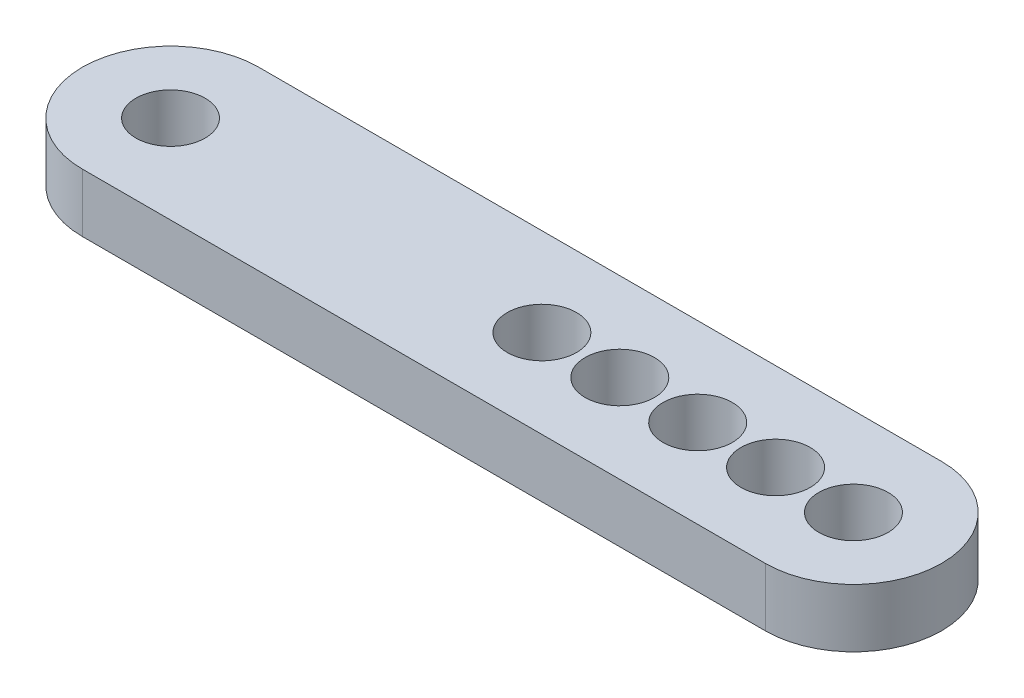
ISO-10303-21;
HEADER;
FILE_DESCRIPTION(('STEP AP214'),'2;1');
FILE_NAME('part.step','',(''),(''),'','','');
FILE_SCHEMA(('AUTOMOTIVE_DESIGN { 1 0 10303 214 1 1 1 1 }'));
ENDSEC;
DATA;
#1=APPLICATION_CONTEXT('core data for automotive mechanical design processes');
#2=APPLICATION_PROTOCOL_DEFINITION('international standard','automotive_design',2000,#1);
#3=PRODUCT_CONTEXT('',#1,'mechanical');
#4=PRODUCT('Part','Part','',(#3));
#5=PRODUCT_RELATED_PRODUCT_CATEGORY('part','',(#4));
#6=PRODUCT_DEFINITION_FORMATION('','',#4);
#7=PRODUCT_DEFINITION_CONTEXT('part definition',#1,'design');
#8=PRODUCT_DEFINITION('design','',#6,#7);
#9=PRODUCT_DEFINITION_SHAPE('','',#8);
#10=(LENGTH_UNIT() NAMED_UNIT(*) SI_UNIT(.MILLI.,.METRE.));
#11=(NAMED_UNIT(*) PLANE_ANGLE_UNIT() SI_UNIT($,.RADIAN.));
#12=(NAMED_UNIT(*) SI_UNIT($,.STERADIAN.) SOLID_ANGLE_UNIT());
#13=UNCERTAINTY_MEASURE_WITH_UNIT(LENGTH_MEASURE(1.E-05),#10,'distance_accuracy_value','');
#14=(GEOMETRIC_REPRESENTATION_CONTEXT(3) GLOBAL_UNCERTAINTY_ASSIGNED_CONTEXT((#13)) GLOBAL_UNIT_ASSIGNED_CONTEXT((#10,
#11,#12)) REPRESENTATION_CONTEXT('',''));
#15=CARTESIAN_POINT('',(0.,0.,0.));
#16=DIRECTION('',(0.,0.,1.));
#17=DIRECTION('',(1.,0.,0.));
#18=AXIS2_PLACEMENT_3D('',#15,#16,#17);
#19=CARTESIAN_POINT('',(0.,3.,0.));
#20=DIRECTION('',(0.,1.,0.));
#21=DIRECTION('',(0.,0.,1.));
#22=AXIS2_PLACEMENT_3D('',#19,#20,#21);
#23=PLANE('',#22);
#24=CARTESIAN_POINT('',(23.07,3.,0.));
#25=DIRECTION('',(0.,1.,0.));
#26=DIRECTION('',(0.,0.,1.));
#27=AXIS2_PLACEMENT_3D('',#24,#25,#26);
#28=CIRCLE('',#27,1.78);
#29=CARTESIAN_POINT('',(23.07,3.,1.78));
#30=VERTEX_POINT('',#29);
#31=EDGE_CURVE('E133',#30,#30,#28,.T.);
#32=ORIENTED_EDGE('',*,*,#31,.F.);
#33=EDGE_LOOP('',(#32));
#34=FACE_BOUND('',#33,.T.);
#35=CARTESIAN_POINT('',(31.07,3.,0.));
#36=DIRECTION('',(0.,1.,0.));
#37=DIRECTION('',(0.,0.,1.));
#38=AXIS2_PLACEMENT_3D('',#35,#36,#37);
#39=CIRCLE('',#38,1.78);
#40=CARTESIAN_POINT('',(31.07,3.,1.77999999999994));
#41=VERTEX_POINT('',#40);
#42=EDGE_CURVE('E121',#41,#41,#39,.T.);
#43=ORIENTED_EDGE('',*,*,#42,.F.);
#44=EDGE_LOOP('',(#43));
#45=FACE_BOUND('',#44,.T.);
#46=CARTESIAN_POINT('',(0.,3.,0.));
#47=DIRECTION('',(0.,1.,0.));
#48=DIRECTION('',(0.,0.,1.));
#49=AXIS2_PLACEMENT_3D('',#46,#47,#48);
#50=CIRCLE('',#49,1.778);
#51=CARTESIAN_POINT('',(0.,3.,1.778));
#52=VERTEX_POINT('',#51);
#53=EDGE_CURVE('E100',#52,#52,#50,.T.);
#54=ORIENTED_EDGE('',*,*,#53,.F.);
#55=EDGE_LOOP('',(#54));
#56=FACE_BOUND('',#55,.T.);
#57=CARTESIAN_POINT('',(0.,3.,0.));
#58=DIRECTION('',(0.,1.,0.));
#59=DIRECTION('',(0.,0.,1.));
#60=AXIS2_PLACEMENT_3D('',#57,#58,#59);
#61=CIRCLE('',#60,4.53);
#62=CARTESIAN_POINT('',(0.,3.,-4.53));
#63=VERTEX_POINT('',#62);
#64=CARTESIAN_POINT('',(0.,3.,4.53));
#65=VERTEX_POINT('',#64);
#66=EDGE_CURVE('E85',#63,#65,#61,.T.);
#67=ORIENTED_EDGE('',*,*,#66,.T.);
#68=DIRECTION('',(1.,0.,0.));
#69=VECTOR('',#68,1.);
#70=CARTESIAN_POINT('',(0.,3.,4.53));
#71=LINE('',#70,#69);
#72=CARTESIAN_POINT('',(35.07,3.,4.53));
#73=VERTEX_POINT('',#72);
#74=EDGE_CURVE('E80',#65,#73,#71,.T.);
#75=ORIENTED_EDGE('',*,*,#74,.T.);
#76=CARTESIAN_POINT('',(35.07,3.,0.));
#77=DIRECTION('',(0.,1.,0.));
#78=DIRECTION('',(0.,0.,1.));
#79=AXIS2_PLACEMENT_3D('',#76,#77,#78);
#80=CIRCLE('',#79,4.53);
#81=CARTESIAN_POINT('',(35.07,3.,-4.53));
#82=VERTEX_POINT('',#81);
#83=EDGE_CURVE('E83',#73,#82,#80,.T.);
#84=ORIENTED_EDGE('',*,*,#83,.T.);
#85=DIRECTION('',(-1.,0.,0.));
#86=VECTOR('',#85,1.);
#87=CARTESIAN_POINT('',(0.,3.,-4.53));
#88=LINE('',#87,#86);
#89=EDGE_CURVE('E50',#82,#63,#88,.T.);
#90=ORIENTED_EDGE('',*,*,#89,.T.);
#91=EDGE_LOOP('',(#67,#75,#84,#90));
#92=FACE_BOUND('',#91,.T.);
#93=CARTESIAN_POINT('',(27.07,3.,0.));
#94=DIRECTION('',(0.,1.,0.));
#95=DIRECTION('',(0.,0.,1.));
#96=AXIS2_PLACEMENT_3D('',#93,#94,#95);
#97=CIRCLE('',#96,1.78);
#98=CARTESIAN_POINT('',(27.07,3.,1.78));
#99=VERTEX_POINT('',#98);
#100=EDGE_CURVE('E115',#99,#99,#97,.T.);
#101=ORIENTED_EDGE('',*,*,#100,.F.);
#102=EDGE_LOOP('',(#101));
#103=FACE_BOUND('',#102,.T.);
#104=CARTESIAN_POINT('',(35.07,3.,-1.11889664200504E-13));
#105=DIRECTION('',(0.,1.,0.));
#106=DIRECTION('',(0.,0.,1.));
#107=AXIS2_PLACEMENT_3D('',#104,#105,#106);
#108=CIRCLE('',#107,1.78);
#109=CARTESIAN_POINT('',(35.07,3.,1.77999999999989));
#110=VERTEX_POINT('',#109);
#111=EDGE_CURVE('E127',#110,#110,#108,.T.);
#112=ORIENTED_EDGE('',*,*,#111,.F.);
#113=EDGE_LOOP('',(#112));
#114=FACE_BOUND('',#113,.T.);
#115=CARTESIAN_POINT('',(19.07,3.,0.));
#116=DIRECTION('',(0.,1.,0.));
#117=DIRECTION('',(0.,0.,1.));
#118=AXIS2_PLACEMENT_3D('',#115,#116,#117);
#119=CIRCLE('',#118,1.78);
#120=CARTESIAN_POINT('',(19.07,3.,1.78));
#121=VERTEX_POINT('',#120);
#122=EDGE_CURVE('E139',#121,#121,#119,.T.);
#123=ORIENTED_EDGE('',*,*,#122,.F.);
#124=EDGE_LOOP('',(#123));
#125=FACE_BOUND('',#124,.T.);
#126=ADVANCED_FACE('F33',(#34,#45,#56,#92,#103,#114,#125),#23,.T.);
#127=CARTESIAN_POINT('',(0.,0.,0.));
#128=DIRECTION('',(0.,1.,0.));
#129=DIRECTION('',(0.,0.,1.));
#130=AXIS2_PLACEMENT_3D('',#127,#128,#129);
#131=PLANE('',#130);
#132=CARTESIAN_POINT('',(0.,0.,0.));
#133=DIRECTION('',(0.,1.,0.));
#134=DIRECTION('',(0.,0.,1.));
#135=AXIS2_PLACEMENT_3D('',#132,#133,#134);
#136=CIRCLE('',#135,4.53);
#137=CARTESIAN_POINT('',(0.,0.,-4.53));
#138=VERTEX_POINT('',#137);
#139=CARTESIAN_POINT('',(0.,0.,4.53));
#140=VERTEX_POINT('',#139);
#141=EDGE_CURVE('E97',#138,#140,#136,.T.);
#142=ORIENTED_EDGE('',*,*,#141,.F.);
#143=DIRECTION('',(-1.,0.,0.));
#144=VECTOR('',#143,1.);
#145=CARTESIAN_POINT('',(0.,0.,-4.53));
#146=LINE('',#145,#144);
#147=CARTESIAN_POINT('',(35.07,0.,-4.53));
#148=VERTEX_POINT('',#147);
#149=EDGE_CURVE('E73',#148,#138,#146,.T.);
#150=ORIENTED_EDGE('',*,*,#149,.F.);
#151=CARTESIAN_POINT('',(35.07,0.,0.));
#152=DIRECTION('',(0.,1.,0.));
#153=DIRECTION('',(0.,0.,1.));
#154=AXIS2_PLACEMENT_3D('',#151,#152,#153);
#155=CIRCLE('',#154,4.53);
#156=CARTESIAN_POINT('',(35.07,0.,4.53));
#157=VERTEX_POINT('',#156);
#158=EDGE_CURVE('E67',#157,#148,#155,.T.);
#159=ORIENTED_EDGE('',*,*,#158,.F.);
#160=DIRECTION('',(1.,0.,0.));
#161=VECTOR('',#160,1.);
#162=CARTESIAN_POINT('',(0.,0.,4.53));
#163=LINE('',#162,#161);
#164=EDGE_CURVE('E89',#140,#157,#163,.T.);
#165=ORIENTED_EDGE('',*,*,#164,.F.);
#166=EDGE_LOOP('',(#142,#150,#159,#165));
#167=FACE_BOUND('',#166,.T.);
#168=CARTESIAN_POINT('',(0.,0.,0.));
#169=DIRECTION('',(0.,1.,0.));
#170=DIRECTION('',(0.,0.,1.));
#171=AXIS2_PLACEMENT_3D('',#168,#169,#170);
#172=CIRCLE('',#171,1.778);
#173=CARTESIAN_POINT('',(0.,0.,1.778));
#174=VERTEX_POINT('',#173);
#175=EDGE_CURVE('E112',#174,#174,#172,.T.);
#176=ORIENTED_EDGE('',*,*,#175,.T.);
#177=EDGE_LOOP('',(#176));
#178=FACE_BOUND('',#177,.T.);
#179=CARTESIAN_POINT('',(27.07,0.,0.));
#180=DIRECTION('',(0.,1.,0.));
#181=DIRECTION('',(0.,0.,1.));
#182=AXIS2_PLACEMENT_3D('',#179,#180,#181);
#183=CIRCLE('',#182,1.78);
#184=CARTESIAN_POINT('',(27.07,0.,1.78));
#185=VERTEX_POINT('',#184);
#186=EDGE_CURVE('E118',#185,#185,#183,.T.);
#187=ORIENTED_EDGE('',*,*,#186,.T.);
#188=EDGE_LOOP('',(#187));
#189=FACE_BOUND('',#188,.T.);
#190=CARTESIAN_POINT('',(31.07,0.,0.));
#191=DIRECTION('',(0.,1.,0.));
#192=DIRECTION('',(0.,0.,1.));
#193=AXIS2_PLACEMENT_3D('',#190,#191,#192);
#194=CIRCLE('',#193,1.78);
#195=CARTESIAN_POINT('',(31.07,0.,1.77999999999994));
#196=VERTEX_POINT('',#195);
#197=EDGE_CURVE('E124',#196,#196,#194,.T.);
#198=ORIENTED_EDGE('',*,*,#197,.T.);
#199=EDGE_LOOP('',(#198));
#200=FACE_BOUND('',#199,.T.);
#201=CARTESIAN_POINT('',(35.07,0.,-1.11889664200504E-13));
#202=DIRECTION('',(0.,1.,0.));
#203=DIRECTION('',(0.,0.,1.));
#204=AXIS2_PLACEMENT_3D('',#201,#202,#203);
#205=CIRCLE('',#204,1.78);
#206=CARTESIAN_POINT('',(35.07,0.,1.77999999999989));
#207=VERTEX_POINT('',#206);
#208=EDGE_CURVE('E130',#207,#207,#205,.T.);
#209=ORIENTED_EDGE('',*,*,#208,.T.);
#210=EDGE_LOOP('',(#209));
#211=FACE_BOUND('',#210,.T.);
#212=CARTESIAN_POINT('',(23.07,0.,0.));
#213=DIRECTION('',(0.,1.,0.));
#214=DIRECTION('',(0.,0.,1.));
#215=AXIS2_PLACEMENT_3D('',#212,#213,#214);
#216=CIRCLE('',#215,1.78);
#217=CARTESIAN_POINT('',(23.07,0.,1.78));
#218=VERTEX_POINT('',#217);
#219=EDGE_CURVE('E136',#218,#218,#216,.T.);
#220=ORIENTED_EDGE('',*,*,#219,.T.);
#221=EDGE_LOOP('',(#220));
#222=FACE_BOUND('',#221,.T.);
#223=CARTESIAN_POINT('',(19.07,0.,0.));
#224=DIRECTION('',(0.,1.,0.));
#225=DIRECTION('',(0.,0.,1.));
#226=AXIS2_PLACEMENT_3D('',#223,#224,#225);
#227=CIRCLE('',#226,1.78);
#228=CARTESIAN_POINT('',(19.07,0.,1.78));
#229=VERTEX_POINT('',#228);
#230=EDGE_CURVE('E142',#229,#229,#227,.T.);
#231=ORIENTED_EDGE('',*,*,#230,.T.);
#232=EDGE_LOOP('',(#231));
#233=FACE_BOUND('',#232,.T.);
#234=ADVANCED_FACE('F108',(#167,#178,#189,#200,#211,#222,#233),#131,.F.);
#235=CARTESIAN_POINT('',(0.,3.,0.));
#236=DIRECTION('',(0.,-1.,0.));
#237=DIRECTION('',(0.,0.,-1.));
#238=AXIS2_PLACEMENT_3D('',#235,#236,#237);
#239=CYLINDRICAL_SURFACE('',#238,4.53);
#240=ORIENTED_EDGE('',*,*,#141,.T.);
#241=DIRECTION('',(0.,-1.,0.));
#242=VECTOR('',#241,1.);
#243=CARTESIAN_POINT('',(0.,3.,4.53));
#244=LINE('',#243,#242);
#245=EDGE_CURVE('E11',#65,#140,#244,.T.);
#246=ORIENTED_EDGE('',*,*,#245,.F.);
#247=ORIENTED_EDGE('',*,*,#66,.F.);
#248=DIRECTION('',(0.,-1.,0.));
#249=VECTOR('',#248,1.);
#250=CARTESIAN_POINT('',(0.,3.,-4.53));
#251=LINE('',#250,#249);
#252=EDGE_CURVE('E93',#63,#138,#251,.T.);
#253=ORIENTED_EDGE('',*,*,#252,.T.);
#254=EDGE_LOOP('',(#240,#246,#247,#253));
#255=FACE_BOUND('',#254,.T.);
#256=ADVANCED_FACE('F35',(#255),#239,.T.);
#257=CARTESIAN_POINT('',(0.,3.,4.53));
#258=DIRECTION('',(0.,0.,-1.));
#259=DIRECTION('',(-1.,0.,0.));
#260=AXIS2_PLACEMENT_3D('',#257,#258,#259);
#261=PLANE('',#260);
#262=ORIENTED_EDGE('',*,*,#164,.T.);
#263=DIRECTION('',(0.,-1.,0.));
#264=VECTOR('',#263,1.);
#265=CARTESIAN_POINT('',(35.07,3.,4.53));
#266=LINE('',#265,#264);
#267=EDGE_CURVE('E42',#73,#157,#266,.T.);
#268=ORIENTED_EDGE('',*,*,#267,.F.);
#269=ORIENTED_EDGE('',*,*,#74,.F.);
#270=ORIENTED_EDGE('',*,*,#245,.T.);
#271=EDGE_LOOP('',(#262,#268,#269,#270));
#272=FACE_BOUND('',#271,.T.);
#273=ADVANCED_FACE('F88',(#272),#261,.F.);
#274=CARTESIAN_POINT('',(35.07,3.,0.));
#275=DIRECTION('',(0.,-1.,0.));
#276=DIRECTION('',(0.,0.,-1.));
#277=AXIS2_PLACEMENT_3D('',#274,#275,#276);
#278=CYLINDRICAL_SURFACE('',#277,4.53);
#279=ORIENTED_EDGE('',*,*,#158,.T.);
#280=DIRECTION('',(0.,-1.,0.));
#281=VECTOR('',#280,1.);
#282=CARTESIAN_POINT('',(35.07,3.,-4.53));
#283=LINE('',#282,#281);
#284=EDGE_CURVE('E90',#82,#148,#283,.T.);
#285=ORIENTED_EDGE('',*,*,#284,.F.);
#286=ORIENTED_EDGE('',*,*,#83,.F.);
#287=ORIENTED_EDGE('',*,*,#267,.T.);
#288=EDGE_LOOP('',(#279,#285,#286,#287));
#289=FACE_BOUND('',#288,.T.);
#290=ADVANCED_FACE('F91',(#289),#278,.T.);
#291=CARTESIAN_POINT('',(0.,3.,-4.53));
#292=DIRECTION('',(0.,0.,1.));
#293=DIRECTION('',(1.,0.,0.));
#294=AXIS2_PLACEMENT_3D('',#291,#292,#293);
#295=PLANE('',#294);
#296=ORIENTED_EDGE('',*,*,#149,.T.);
#297=ORIENTED_EDGE('',*,*,#252,.F.);
#298=ORIENTED_EDGE('',*,*,#89,.F.);
#299=ORIENTED_EDGE('',*,*,#284,.T.);
#300=EDGE_LOOP('',(#296,#297,#298,#299));
#301=FACE_BOUND('',#300,.T.);
#302=ADVANCED_FACE('F105',(#301),#295,.F.);
#303=CARTESIAN_POINT('',(0.,3.,0.));
#304=DIRECTION('',(0.,-1.,0.));
#305=DIRECTION('',(0.,0.,-1.));
#306=AXIS2_PLACEMENT_3D('',#303,#304,#305);
#307=CYLINDRICAL_SURFACE('',#306,1.778);
#308=ORIENTED_EDGE('',*,*,#53,.T.);
#309=EDGE_LOOP('',(#308));
#310=FACE_BOUND('',#309,.T.);
#311=ORIENTED_EDGE('',*,*,#175,.F.);
#312=EDGE_LOOP('',(#311));
#313=FACE_BOUND('',#312,.T.);
#314=ADVANCED_FACE('F161',(#310,#313),#307,.F.);
#315=CARTESIAN_POINT('',(27.07,3.,0.));
#316=DIRECTION('',(0.,-1.,0.));
#317=DIRECTION('',(0.,0.,-1.));
#318=AXIS2_PLACEMENT_3D('',#315,#316,#317);
#319=CYLINDRICAL_SURFACE('',#318,1.78);
#320=ORIENTED_EDGE('',*,*,#100,.T.);
#321=EDGE_LOOP('',(#320));
#322=FACE_BOUND('',#321,.T.);
#323=ORIENTED_EDGE('',*,*,#186,.F.);
#324=EDGE_LOOP('',(#323));
#325=FACE_BOUND('',#324,.T.);
#326=ADVANCED_FACE('F207',(#322,#325),#319,.F.);
#327=CARTESIAN_POINT('',(31.07,3.,0.));
#328=DIRECTION('',(0.,-1.,0.));
#329=DIRECTION('',(0.,0.,-1.));
#330=AXIS2_PLACEMENT_3D('',#327,#328,#329);
#331=CYLINDRICAL_SURFACE('',#330,1.78);
#332=ORIENTED_EDGE('',*,*,#42,.T.);
#333=EDGE_LOOP('',(#332));
#334=FACE_BOUND('',#333,.T.);
#335=ORIENTED_EDGE('',*,*,#197,.F.);
#336=EDGE_LOOP('',(#335));
#337=FACE_BOUND('',#336,.T.);
#338=ADVANCED_FACE('F215',(#334,#337),#331,.F.);
#339=CARTESIAN_POINT('',(35.07,3.,-1.11889664200504E-13));
#340=DIRECTION('',(0.,-1.,0.));
#341=DIRECTION('',(0.,0.,-1.));
#342=AXIS2_PLACEMENT_3D('',#339,#340,#341);
#343=CYLINDRICAL_SURFACE('',#342,1.78);
#344=ORIENTED_EDGE('',*,*,#111,.T.);
#345=EDGE_LOOP('',(#344));
#346=FACE_BOUND('',#345,.T.);
#347=ORIENTED_EDGE('',*,*,#208,.F.);
#348=EDGE_LOOP('',(#347));
#349=FACE_BOUND('',#348,.T.);
#350=ADVANCED_FACE('F223',(#346,#349),#343,.F.);
#351=CARTESIAN_POINT('',(23.07,3.,0.));
#352=DIRECTION('',(0.,-1.,0.));
#353=DIRECTION('',(0.,0.,-1.));
#354=AXIS2_PLACEMENT_3D('',#351,#352,#353);
#355=CYLINDRICAL_SURFACE('',#354,1.78);
#356=ORIENTED_EDGE('',*,*,#31,.T.);
#357=EDGE_LOOP('',(#356));
#358=FACE_BOUND('',#357,.T.);
#359=ORIENTED_EDGE('',*,*,#219,.F.);
#360=EDGE_LOOP('',(#359));
#361=FACE_BOUND('',#360,.T.);
#362=ADVANCED_FACE('F232',(#358,#361),#355,.F.);
#363=CARTESIAN_POINT('',(19.07,3.,0.));
#364=DIRECTION('',(0.,-1.,0.));
#365=DIRECTION('',(0.,0.,-1.));
#366=AXIS2_PLACEMENT_3D('',#363,#364,#365);
#367=CYLINDRICAL_SURFACE('',#366,1.78);
#368=ORIENTED_EDGE('',*,*,#122,.T.);
#369=EDGE_LOOP('',(#368));
#370=FACE_BOUND('',#369,.T.);
#371=ORIENTED_EDGE('',*,*,#230,.F.);
#372=EDGE_LOOP('',(#371));
#373=FACE_BOUND('',#372,.T.);
#374=ADVANCED_FACE('F148',(#370,#373),#367,.F.);
#375=CLOSED_SHELL('',(#126,#234,#256,#273,#290,#302,#314,#326,#338,#350,#362,#374));
#376=MANIFOLD_SOLID_BREP('B2',#375);
#377=ADVANCED_BREP_SHAPE_REPRESENTATION('',(#18,#376),#14);
#378=SHAPE_DEFINITION_REPRESENTATION(#9,#377);
ENDSEC;
END-ISO-10303-21;
